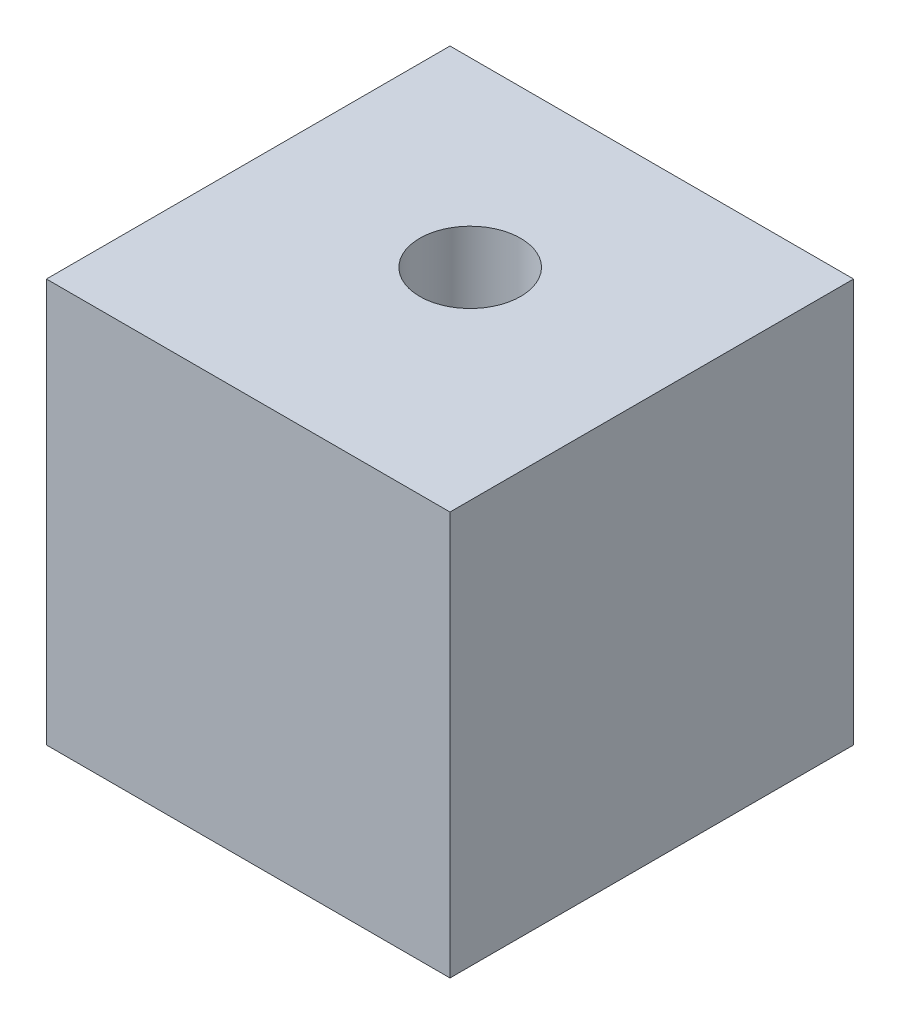
ISO-10303-21;
HEADER;
FILE_DESCRIPTION(('STEP AP214'),'2;1');
FILE_NAME('part.step','',(''),(''),'','','');
FILE_SCHEMA(('AUTOMOTIVE_DESIGN { 1 0 10303 214 1 1 1 1 }'));
ENDSEC;
DATA;
#1=APPLICATION_CONTEXT('core data for automotive mechanical design processes');
#2=APPLICATION_PROTOCOL_DEFINITION('international standard','automotive_design',2000,#1);
#3=PRODUCT_CONTEXT('',#1,'mechanical');
#4=PRODUCT('Part','Part','',(#3));
#5=PRODUCT_RELATED_PRODUCT_CATEGORY('part','',(#4));
#6=PRODUCT_DEFINITION_FORMATION('','',#4);
#7=PRODUCT_DEFINITION_CONTEXT('part definition',#1,'design');
#8=PRODUCT_DEFINITION('design','',#6,#7);
#9=PRODUCT_DEFINITION_SHAPE('','',#8);
#10=(LENGTH_UNIT() NAMED_UNIT(*) SI_UNIT(.MILLI.,.METRE.));
#11=(NAMED_UNIT(*) PLANE_ANGLE_UNIT() SI_UNIT($,.RADIAN.));
#12=(NAMED_UNIT(*) SI_UNIT($,.STERADIAN.) SOLID_ANGLE_UNIT());
#13=UNCERTAINTY_MEASURE_WITH_UNIT(LENGTH_MEASURE(1.E-05),#10,'distance_accuracy_value','');
#14=(GEOMETRIC_REPRESENTATION_CONTEXT(3) GLOBAL_UNCERTAINTY_ASSIGNED_CONTEXT((#13)) GLOBAL_UNIT_ASSIGNED_CONTEXT((#10,
#11,#12)) REPRESENTATION_CONTEXT('',''));
#15=CARTESIAN_POINT('',(0.,0.,0.));
#16=DIRECTION('',(0.,0.,1.));
#17=DIRECTION('',(1.,0.,0.));
#18=AXIS2_PLACEMENT_3D('',#15,#16,#17);
#19=CARTESIAN_POINT('',(0.,10.,0.));
#20=DIRECTION('',(1.,0.,0.));
#21=DIRECTION('',(0.,0.,-1.));
#22=AXIS2_PLACEMENT_3D('',#19,#20,#21);
#23=PLANE('',#22);
#24=DIRECTION('',(0.,0.,1.));
#25=VECTOR('',#24,1.);
#26=CARTESIAN_POINT('',(0.,0.,0.));
#27=LINE('',#26,#25);
#28=CARTESIAN_POINT('',(0.,0.,-10.));
#29=VERTEX_POINT('',#28);
#30=CARTESIAN_POINT('',(0.,0.,0.));
#31=VERTEX_POINT('',#30);
#32=EDGE_CURVE('E99',#29,#31,#27,.T.);
#33=ORIENTED_EDGE('',*,*,#32,.T.);
#34=DIRECTION('',(0.,-1.,0.));
#35=VECTOR('',#34,1.);
#36=CARTESIAN_POINT('',(0.,10.,0.));
#37=LINE('',#36,#35);
#38=CARTESIAN_POINT('',(0.,10.,0.));
#39=VERTEX_POINT('',#38);
#40=EDGE_CURVE('E11',#39,#31,#37,.T.);
#41=ORIENTED_EDGE('',*,*,#40,.F.);
#42=DIRECTION('',(0.,0.,1.));
#43=VECTOR('',#42,1.);
#44=CARTESIAN_POINT('',(0.,10.,0.));
#45=LINE('',#44,#43);
#46=CARTESIAN_POINT('',(0.,10.,-10.));
#47=VERTEX_POINT('',#46);
#48=EDGE_CURVE('E87',#47,#39,#45,.T.);
#49=ORIENTED_EDGE('',*,*,#48,.F.);
#50=DIRECTION('',(0.,-1.,0.));
#51=VECTOR('',#50,1.);
#52=CARTESIAN_POINT('',(0.,10.,-10.));
#53=LINE('',#52,#51);
#54=EDGE_CURVE('E95',#47,#29,#53,.T.);
#55=ORIENTED_EDGE('',*,*,#54,.T.);
#56=EDGE_LOOP('',(#33,#41,#49,#55));
#57=FACE_BOUND('',#56,.T.);
#58=ADVANCED_FACE('F36',(#57),#23,.F.);
#59=CARTESIAN_POINT('',(0.,10.,0.));
#60=DIRECTION('',(0.,0.,-1.));
#61=DIRECTION('',(-1.,0.,0.));
#62=AXIS2_PLACEMENT_3D('',#59,#60,#61);
#63=PLANE('',#62);
#64=DIRECTION('',(1.,0.,0.));
#65=VECTOR('',#64,1.);
#66=CARTESIAN_POINT('',(0.,0.,0.));
#67=LINE('',#66,#65);
#68=CARTESIAN_POINT('',(10.,0.,0.));
#69=VERTEX_POINT('',#68);
#70=EDGE_CURVE('E91',#31,#69,#67,.T.);
#71=ORIENTED_EDGE('',*,*,#70,.T.);
#72=DIRECTION('',(0.,-1.,0.));
#73=VECTOR('',#72,1.);
#74=CARTESIAN_POINT('',(10.,10.,0.));
#75=LINE('',#74,#73);
#76=CARTESIAN_POINT('',(10.,10.,0.));
#77=VERTEX_POINT('',#76);
#78=EDGE_CURVE('E44',#77,#69,#75,.T.);
#79=ORIENTED_EDGE('',*,*,#78,.F.);
#80=DIRECTION('',(1.,0.,0.));
#81=VECTOR('',#80,1.);
#82=CARTESIAN_POINT('',(0.,10.,0.));
#83=LINE('',#82,#81);
#84=EDGE_CURVE('E82',#39,#77,#83,.T.);
#85=ORIENTED_EDGE('',*,*,#84,.F.);
#86=ORIENTED_EDGE('',*,*,#40,.T.);
#87=EDGE_LOOP('',(#71,#79,#85,#86));
#88=FACE_BOUND('',#87,.T.);
#89=ADVANCED_FACE('F90',(#88),#63,.F.);
#90=CARTESIAN_POINT('',(10.,10.,0.));
#91=DIRECTION('',(-1.,0.,0.));
#92=DIRECTION('',(0.,0.,1.));
#93=AXIS2_PLACEMENT_3D('',#90,#91,#92);
#94=PLANE('',#93);
#95=DIRECTION('',(0.,0.,-1.));
#96=VECTOR('',#95,1.);
#97=CARTESIAN_POINT('',(10.,0.,0.));
#98=LINE('',#97,#96);
#99=CARTESIAN_POINT('',(10.,0.,-10.));
#100=VERTEX_POINT('',#99);
#101=EDGE_CURVE('E69',#69,#100,#98,.T.);
#102=ORIENTED_EDGE('',*,*,#101,.T.);
#103=DIRECTION('',(0.,-1.,0.));
#104=VECTOR('',#103,1.);
#105=CARTESIAN_POINT('',(10.,10.,-10.));
#106=LINE('',#105,#104);
#107=CARTESIAN_POINT('',(10.,10.,-10.));
#108=VERTEX_POINT('',#107);
#109=EDGE_CURVE('E92',#108,#100,#106,.T.);
#110=ORIENTED_EDGE('',*,*,#109,.F.);
#111=DIRECTION('',(0.,0.,-1.));
#112=VECTOR('',#111,1.);
#113=CARTESIAN_POINT('',(10.,10.,0.));
#114=LINE('',#113,#112);
#115=EDGE_CURVE('E85',#77,#108,#114,.T.);
#116=ORIENTED_EDGE('',*,*,#115,.F.);
#117=ORIENTED_EDGE('',*,*,#78,.T.);
#118=EDGE_LOOP('',(#102,#110,#116,#117));
#119=FACE_BOUND('',#118,.T.);
#120=ADVANCED_FACE('F93',(#119),#94,.F.);
#121=CARTESIAN_POINT('',(0.,10.,-10.));
#122=DIRECTION('',(0.,0.,1.));
#123=DIRECTION('',(1.,0.,0.));
#124=AXIS2_PLACEMENT_3D('',#121,#122,#123);
#125=PLANE('',#124);
#126=DIRECTION('',(-1.,0.,0.));
#127=VECTOR('',#126,1.);
#128=CARTESIAN_POINT('',(0.,0.,-10.));
#129=LINE('',#128,#127);
#130=EDGE_CURVE('E75',#100,#29,#129,.T.);
#131=ORIENTED_EDGE('',*,*,#130,.T.);
#132=ORIENTED_EDGE('',*,*,#54,.F.);
#133=DIRECTION('',(-1.,0.,0.));
#134=VECTOR('',#133,1.);
#135=CARTESIAN_POINT('',(0.,10.,-10.));
#136=LINE('',#135,#134);
#137=EDGE_CURVE('E52',#108,#47,#136,.T.);
#138=ORIENTED_EDGE('',*,*,#137,.F.);
#139=ORIENTED_EDGE('',*,*,#109,.T.);
#140=EDGE_LOOP('',(#131,#132,#138,#139));
#141=FACE_BOUND('',#140,.T.);
#142=ADVANCED_FACE('F107',(#141),#125,.F.);
#143=CARTESIAN_POINT('',(0.,10.,0.));
#144=DIRECTION('',(0.,-1.,0.));
#145=DIRECTION('',(0.,0.,-1.));
#146=AXIS2_PLACEMENT_3D('',#143,#144,#145);
#147=PLANE('',#146);
#148=CARTESIAN_POINT('',(5.,10.,-5.5));
#149=DIRECTION('',(0.,1.,0.));
#150=DIRECTION('',(0.,0.,1.));
#151=AXIS2_PLACEMENT_3D('',#148,#149,#150);
#152=CIRCLE('',#151,1.25);
#153=CARTESIAN_POINT('',(5.,10.,-4.25));
#154=VERTEX_POINT('',#153);
#155=EDGE_CURVE('E113',#154,#154,#152,.T.);
#156=ORIENTED_EDGE('',*,*,#155,.F.);
#157=EDGE_LOOP('',(#156));
#158=FACE_BOUND('',#157,.T.);
#159=ORIENTED_EDGE('',*,*,#48,.T.);
#160=ORIENTED_EDGE('',*,*,#84,.T.);
#161=ORIENTED_EDGE('',*,*,#115,.T.);
#162=ORIENTED_EDGE('',*,*,#137,.T.);
#163=EDGE_LOOP('',(#159,#160,#161,#162));
#164=FACE_BOUND('',#163,.T.);
#165=ADVANCED_FACE('F83',(#158,#164),#147,.F.);
#166=CARTESIAN_POINT('',(0.,0.,0.));
#167=DIRECTION('',(0.,-1.,0.));
#168=DIRECTION('',(0.,0.,-1.));
#169=AXIS2_PLACEMENT_3D('',#166,#167,#168);
#170=PLANE('',#169);
#171=CARTESIAN_POINT('',(5.,0.,-5.5));
#172=DIRECTION('',(0.,1.,0.));
#173=DIRECTION('',(0.,0.,1.));
#174=AXIS2_PLACEMENT_3D('',#171,#172,#173);
#175=CIRCLE('',#174,1.25);
#176=CARTESIAN_POINT('',(5.,0.,-4.25));
#177=VERTEX_POINT('',#176);
#178=EDGE_CURVE('E102',#177,#177,#175,.T.);
#179=ORIENTED_EDGE('',*,*,#178,.T.);
#180=EDGE_LOOP('',(#179));
#181=FACE_BOUND('',#180,.T.);
#182=ORIENTED_EDGE('',*,*,#32,.F.);
#183=ORIENTED_EDGE('',*,*,#130,.F.);
#184=ORIENTED_EDGE('',*,*,#101,.F.);
#185=ORIENTED_EDGE('',*,*,#70,.F.);
#186=EDGE_LOOP('',(#182,#183,#184,#185));
#187=FACE_BOUND('',#186,.T.);
#188=ADVANCED_FACE('F110',(#181,#187),#170,.T.);
#189=CARTESIAN_POINT('',(5.,0.,-5.5));
#190=DIRECTION('',(0.,1.,0.));
#191=DIRECTION('',(0.,0.,1.));
#192=AXIS2_PLACEMENT_3D('',#189,#190,#191);
#193=CYLINDRICAL_SURFACE('',#192,1.25);
#194=ORIENTED_EDGE('',*,*,#178,.F.);
#195=EDGE_LOOP('',(#194));
#196=FACE_BOUND('',#195,.T.);
#197=ORIENTED_EDGE('',*,*,#155,.T.);
#198=EDGE_LOOP('',(#197));
#199=FACE_BOUND('',#198,.T.);
#200=ADVANCED_FACE('F120',(#196,#199),#193,.F.);
#201=CLOSED_SHELL('',(#58,#89,#120,#142,#165,#188,#200));
#202=MANIFOLD_SOLID_BREP('B2',#201);
#203=ADVANCED_BREP_SHAPE_REPRESENTATION('',(#18,#202),#14);
#204=SHAPE_DEFINITION_REPRESENTATION(#9,#203);
ENDSEC;
END-ISO-10303-21;
